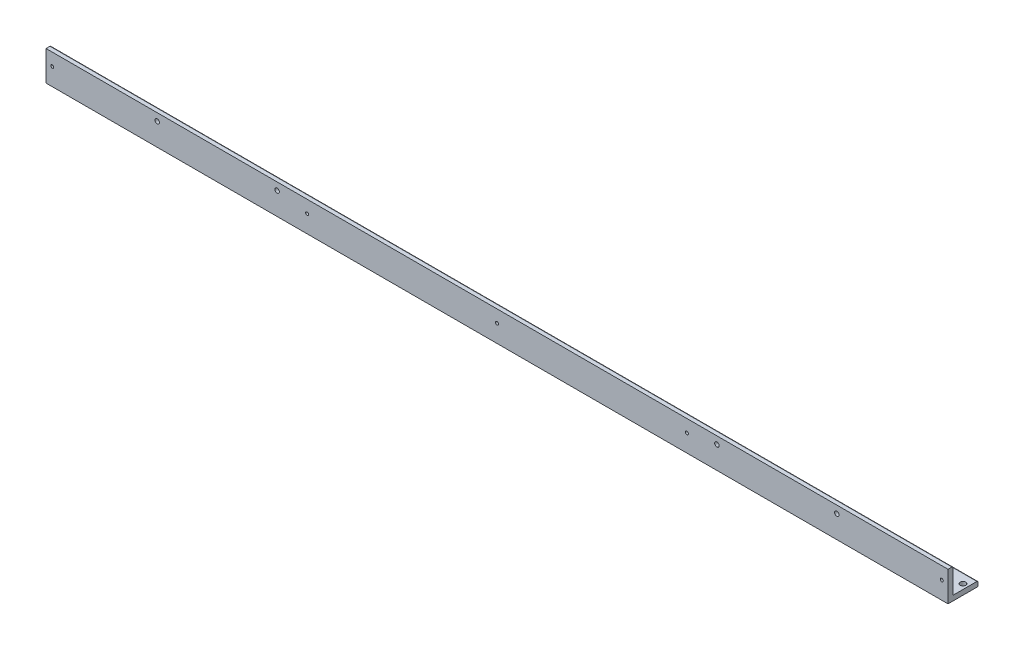
ISO-10303-21;
HEADER;
FILE_DESCRIPTION(('STEP AP214'),'2;1');
FILE_NAME('part.step','',(''),(''),'','','');
FILE_SCHEMA(('AUTOMOTIVE_DESIGN { 1 0 10303 214 1 1 1 1 }'));
ENDSEC;
DATA;
#1=APPLICATION_CONTEXT('core data for automotive mechanical design processes');
#2=APPLICATION_PROTOCOL_DEFINITION('international standard','automotive_design',2000,#1);
#3=PRODUCT_CONTEXT('',#1,'mechanical');
#4=PRODUCT('Part','Part','',(#3));
#5=PRODUCT_RELATED_PRODUCT_CATEGORY('part','',(#4));
#6=PRODUCT_DEFINITION_FORMATION('','',#4);
#7=PRODUCT_DEFINITION_CONTEXT('part definition',#1,'design');
#8=PRODUCT_DEFINITION('design','',#6,#7);
#9=PRODUCT_DEFINITION_SHAPE('','',#8);
#10=(LENGTH_UNIT() NAMED_UNIT(*) SI_UNIT(.MILLI.,.METRE.));
#11=(NAMED_UNIT(*) PLANE_ANGLE_UNIT() SI_UNIT($,.RADIAN.));
#12=(NAMED_UNIT(*) SI_UNIT($,.STERADIAN.) SOLID_ANGLE_UNIT());
#13=UNCERTAINTY_MEASURE_WITH_UNIT(LENGTH_MEASURE(1.E-05),#10,'distance_accuracy_value','');
#14=(GEOMETRIC_REPRESENTATION_CONTEXT(3) GLOBAL_UNCERTAINTY_ASSIGNED_CONTEXT((#13)) GLOBAL_UNIT_ASSIGNED_CONTEXT((#10,
#11,#12)) REPRESENTATION_CONTEXT('',''));
#15=CARTESIAN_POINT('',(0.,0.,0.));
#16=DIRECTION('',(0.,0.,1.));
#17=DIRECTION('',(1.,0.,0.));
#18=AXIS2_PLACEMENT_3D('',#15,#16,#17);
#19=CARTESIAN_POINT('',(573.0875,38.1,0.));
#20=DIRECTION('',(0.,0.,-1.));
#21=DIRECTION('',(0.,1.,0.));
#22=AXIS2_PLACEMENT_3D('',#19,#20,#21);
#23=PLANE('',#22);
#24=CARTESIAN_POINT('',(-431.8,28.575,0.));
#25=DIRECTION('',(0.,0.,1.));
#26=DIRECTION('',(1.,0.,0.));
#27=AXIS2_PLACEMENT_3D('',#24,#25,#26);
#28=CIRCLE('',#27,2.8067);
#29=CARTESIAN_POINT('',(-428.9933,28.575,0.));
#30=VERTEX_POINT('',#29);
#31=EDGE_CURVE('E243',#30,#30,#28,.T.);
#32=ORIENTED_EDGE('',*,*,#31,.F.);
#33=EDGE_LOOP('',(#32));
#34=FACE_BOUND('',#33,.T.);
#35=CARTESIAN_POINT('',(431.8,28.575,0.));
#36=DIRECTION('',(0.,0.,1.));
#37=DIRECTION('',(1.,0.,0.));
#38=AXIS2_PLACEMENT_3D('',#35,#36,#37);
#39=CIRCLE('',#38,2.8067);
#40=CARTESIAN_POINT('',(434.6067,28.575,0.));
#41=VERTEX_POINT('',#40);
#42=EDGE_CURVE('E225',#41,#41,#39,.T.);
#43=ORIENTED_EDGE('',*,*,#42,.F.);
#44=EDGE_LOOP('',(#43));
#45=FACE_BOUND('',#44,.T.);
#46=CARTESIAN_POINT('',(-565.15,22.225,0.));
#47=DIRECTION('',(0.,0.,1.));
#48=DIRECTION('',(1.,0.,0.));
#49=AXIS2_PLACEMENT_3D('',#46,#47,#48);
#50=CIRCLE('',#49,1.89865);
#51=CARTESIAN_POINT('',(-563.25135,22.225,0.));
#52=VERTEX_POINT('',#51);
#53=EDGE_CURVE('E219',#52,#52,#50,.T.);
#54=ORIENTED_EDGE('',*,*,#53,.F.);
#55=EDGE_LOOP('',(#54));
#56=FACE_BOUND('',#55,.T.);
#57=CARTESIAN_POINT('',(565.15,22.225,0.));
#58=DIRECTION('',(0.,0.,1.));
#59=DIRECTION('',(1.,0.,0.));
#60=AXIS2_PLACEMENT_3D('',#57,#58,#59);
#61=CIRCLE('',#60,1.89865);
#62=CARTESIAN_POINT('',(567.04865,22.225,0.));
#63=VERTEX_POINT('',#62);
#64=EDGE_CURVE('E213',#63,#63,#61,.T.);
#65=ORIENTED_EDGE('',*,*,#64,.F.);
#66=EDGE_LOOP('',(#65));
#67=FACE_BOUND('',#66,.T.);
#68=CARTESIAN_POINT('',(-241.3,22.225,0.));
#69=DIRECTION('',(0.,0.,1.));
#70=DIRECTION('',(1.,0.,0.));
#71=AXIS2_PLACEMENT_3D('',#68,#69,#70);
#72=CIRCLE('',#71,1.89865);
#73=CARTESIAN_POINT('',(-239.40135,22.225,0.));
#74=VERTEX_POINT('',#73);
#75=EDGE_CURVE('E207',#74,#74,#72,.T.);
#76=ORIENTED_EDGE('',*,*,#75,.F.);
#77=EDGE_LOOP('',(#76));
#78=FACE_BOUND('',#77,.T.);
#79=CARTESIAN_POINT('',(241.3,22.225,0.));
#80=DIRECTION('',(0.,0.,1.));
#81=DIRECTION('',(1.,0.,0.));
#82=AXIS2_PLACEMENT_3D('',#79,#80,#81);
#83=CIRCLE('',#82,1.89865);
#84=CARTESIAN_POINT('',(243.19865,22.225,0.));
#85=VERTEX_POINT('',#84);
#86=EDGE_CURVE('E201',#85,#85,#83,.T.);
#87=ORIENTED_EDGE('',*,*,#86,.F.);
#88=EDGE_LOOP('',(#87));
#89=FACE_BOUND('',#88,.T.);
#90=CARTESIAN_POINT('',(0.,22.225,0.));
#91=DIRECTION('',(0.,0.,1.));
#92=DIRECTION('',(1.,0.,0.));
#93=AXIS2_PLACEMENT_3D('',#90,#91,#92);
#94=CIRCLE('',#93,1.89864999999999);
#95=CARTESIAN_POINT('',(1.89864999999999,22.225,0.));
#96=VERTEX_POINT('',#95);
#97=EDGE_CURVE('E195',#96,#96,#94,.T.);
#98=ORIENTED_EDGE('',*,*,#97,.F.);
#99=EDGE_LOOP('',(#98));
#100=FACE_BOUND('',#99,.T.);
#101=DIRECTION('',(0.,-1.,0.));
#102=VECTOR('',#101,1.);
#103=CARTESIAN_POINT('',(-573.0875,38.1,0.));
#104=LINE('',#103,#102);
#105=CARTESIAN_POINT('',(-573.0875,38.1,0.));
#106=VERTEX_POINT('',#105);
#107=CARTESIAN_POINT('',(-573.0875,0.,0.));
#108=VERTEX_POINT('',#107);
#109=EDGE_CURVE('E136',#106,#108,#104,.T.);
#110=ORIENTED_EDGE('',*,*,#109,.T.);
#111=DIRECTION('',(-1.,0.,0.));
#112=VECTOR('',#111,1.);
#113=CARTESIAN_POINT('',(573.0875,0.,0.));
#114=LINE('',#113,#112);
#115=CARTESIAN_POINT('',(573.0875,0.,0.));
#116=VERTEX_POINT('',#115);
#117=EDGE_CURVE('E45',#116,#108,#114,.T.);
#118=ORIENTED_EDGE('',*,*,#117,.F.);
#119=DIRECTION('',(0.,-1.,0.));
#120=VECTOR('',#119,1.);
#121=CARTESIAN_POINT('',(573.0875,38.1,0.));
#122=LINE('',#121,#120);
#123=CARTESIAN_POINT('',(573.0875,38.1,0.));
#124=VERTEX_POINT('',#123);
#125=EDGE_CURVE('E96',#124,#116,#122,.T.);
#126=ORIENTED_EDGE('',*,*,#125,.F.);
#127=DIRECTION('',(-1.,0.,0.));
#128=VECTOR('',#127,1.);
#129=CARTESIAN_POINT('',(573.0875,38.1,0.));
#130=LINE('',#129,#128);
#131=EDGE_CURVE('E11',#124,#106,#130,.T.);
#132=ORIENTED_EDGE('',*,*,#131,.T.);
#133=EDGE_LOOP('',(#110,#118,#126,#132));
#134=FACE_BOUND('',#133,.T.);
#135=CARTESIAN_POINT('',(279.4,28.575,0.));
#136=DIRECTION('',(0.,0.,1.));
#137=DIRECTION('',(1.,0.,0.));
#138=AXIS2_PLACEMENT_3D('',#135,#136,#137);
#139=CIRCLE('',#138,2.8067);
#140=CARTESIAN_POINT('',(282.2067,28.575,0.));
#141=VERTEX_POINT('',#140);
#142=EDGE_CURVE('E231',#141,#141,#139,.T.);
#143=ORIENTED_EDGE('',*,*,#142,.F.);
#144=EDGE_LOOP('',(#143));
#145=FACE_BOUND('',#144,.T.);
#146=CARTESIAN_POINT('',(-279.4,28.575,0.));
#147=DIRECTION('',(0.,0.,1.));
#148=DIRECTION('',(1.,0.,0.));
#149=AXIS2_PLACEMENT_3D('',#146,#147,#148);
#150=CIRCLE('',#149,2.8067);
#151=CARTESIAN_POINT('',(-276.5933,28.575,0.));
#152=VERTEX_POINT('',#151);
#153=EDGE_CURVE('E237',#152,#152,#150,.T.);
#154=ORIENTED_EDGE('',*,*,#153,.F.);
#155=EDGE_LOOP('',(#154));
#156=FACE_BOUND('',#155,.T.);
#157=ADVANCED_FACE('F36',(#34,#45,#56,#67,#78,#89,#100,#134,#145,#156),#23,.F.);
#158=CARTESIAN_POINT('',(573.0875,38.1,-4.826));
#159=DIRECTION('',(0.,-1.,0.));
#160=DIRECTION('',(0.,0.,-1.));
#161=AXIS2_PLACEMENT_3D('',#158,#159,#160);
#162=PLANE('',#161);
#163=DIRECTION('',(0.,0.,1.));
#164=VECTOR('',#163,1.);
#165=CARTESIAN_POINT('',(-573.0875,38.1,-4.826));
#166=LINE('',#165,#164);
#167=CARTESIAN_POINT('',(-573.0875,38.1,-4.826));
#168=VERTEX_POINT('',#167);
#169=EDGE_CURVE('E133',#168,#106,#166,.T.);
#170=ORIENTED_EDGE('',*,*,#169,.T.);
#171=ORIENTED_EDGE('',*,*,#131,.F.);
#172=DIRECTION('',(0.,0.,1.));
#173=VECTOR('',#172,1.);
#174=CARTESIAN_POINT('',(573.0875,38.1,-4.826));
#175=LINE('',#174,#173);
#176=CARTESIAN_POINT('',(573.0875,38.1,-4.826));
#177=VERTEX_POINT('',#176);
#178=EDGE_CURVE('E148',#177,#124,#175,.T.);
#179=ORIENTED_EDGE('',*,*,#178,.F.);
#180=DIRECTION('',(-1.,0.,0.));
#181=VECTOR('',#180,1.);
#182=CARTESIAN_POINT('',(573.0875,38.1,-4.826));
#183=LINE('',#182,#181);
#184=EDGE_CURVE('E129',#177,#168,#183,.T.);
#185=ORIENTED_EDGE('',*,*,#184,.T.);
#186=EDGE_LOOP('',(#170,#171,#179,#185));
#187=FACE_BOUND('',#186,.T.);
#188=ADVANCED_FACE('F38',(#187),#162,.F.);
#189=CARTESIAN_POINT('',(573.0875,0.,0.));
#190=DIRECTION('',(0.,1.,0.));
#191=DIRECTION('',(0.,0.,1.));
#192=AXIS2_PLACEMENT_3D('',#189,#190,#191);
#193=PLANE('',#192);
#194=CARTESIAN_POINT('',(566.7375,0.,-25.4));
#195=DIRECTION('',(0.,1.,0.));
#196=DIRECTION('',(0.,0.,1.));
#197=AXIS2_PLACEMENT_3D('',#194,#195,#196);
#198=CIRCLE('',#197,3.57123999999998);
#199=CARTESIAN_POINT('',(566.7375,0.,-21.8287600000001));
#200=VERTEX_POINT('',#199);
#201=EDGE_CURVE('E186',#200,#200,#198,.T.);
#202=ORIENTED_EDGE('',*,*,#201,.T.);
#203=EDGE_LOOP('',(#202));
#204=FACE_BOUND('',#203,.T.);
#205=CARTESIAN_POINT('',(-566.7375,0.,-25.4));
#206=DIRECTION('',(0.,1.,0.));
#207=DIRECTION('',(0.,0.,1.));
#208=AXIS2_PLACEMENT_3D('',#205,#206,#207);
#209=CIRCLE('',#208,3.57123999999998);
#210=CARTESIAN_POINT('',(-566.7375,0.,-21.8287600000001));
#211=VERTEX_POINT('',#210);
#212=EDGE_CURVE('E137',#211,#211,#209,.T.);
#213=ORIENTED_EDGE('',*,*,#212,.T.);
#214=EDGE_LOOP('',(#213));
#215=FACE_BOUND('',#214,.T.);
#216=DIRECTION('',(0.,0.,-1.));
#217=VECTOR('',#216,1.);
#218=CARTESIAN_POINT('',(-573.0875,0.,0.));
#219=LINE('',#218,#217);
#220=CARTESIAN_POINT('',(-573.0875,0.,-38.1));
#221=VERTEX_POINT('',#220);
#222=EDGE_CURVE('E139',#108,#221,#219,.T.);
#223=ORIENTED_EDGE('',*,*,#222,.T.);
#224=DIRECTION('',(-1.,0.,0.));
#225=VECTOR('',#224,1.);
#226=CARTESIAN_POINT('',(573.0875,0.,-38.1));
#227=LINE('',#226,#225);
#228=CARTESIAN_POINT('',(573.0875,0.,-38.1));
#229=VERTEX_POINT('',#228);
#230=EDGE_CURVE('E155',#229,#221,#227,.T.);
#231=ORIENTED_EDGE('',*,*,#230,.F.);
#232=DIRECTION('',(0.,0.,-1.));
#233=VECTOR('',#232,1.);
#234=CARTESIAN_POINT('',(573.0875,0.,0.));
#235=LINE('',#234,#233);
#236=EDGE_CURVE('E163',#116,#229,#235,.T.);
#237=ORIENTED_EDGE('',*,*,#236,.F.);
#238=ORIENTED_EDGE('',*,*,#117,.T.);
#239=EDGE_LOOP('',(#223,#231,#237,#238));
#240=FACE_BOUND('',#239,.T.);
#241=ADVANCED_FACE('F161',(#204,#215,#240),#193,.F.);
#242=CARTESIAN_POINT('',(573.0875,0.,-38.1));
#243=DIRECTION('',(0.,0.,1.));
#244=DIRECTION('',(1.,0.,0.));
#245=AXIS2_PLACEMENT_3D('',#242,#243,#244);
#246=PLANE('',#245);
#247=DIRECTION('',(0.,1.,0.));
#248=VECTOR('',#247,1.);
#249=CARTESIAN_POINT('',(-573.0875,0.,-38.1));
#250=LINE('',#249,#248);
#251=CARTESIAN_POINT('',(-573.0875,4.826,-38.1));
#252=VERTEX_POINT('',#251);
#253=EDGE_CURVE('E141',#221,#252,#250,.T.);
#254=ORIENTED_EDGE('',*,*,#253,.T.);
#255=DIRECTION('',(-1.,0.,0.));
#256=VECTOR('',#255,1.);
#257=CARTESIAN_POINT('',(573.0875,4.826,-38.1));
#258=LINE('',#257,#256);
#259=CARTESIAN_POINT('',(573.0875,4.826,-38.1));
#260=VERTEX_POINT('',#259);
#261=EDGE_CURVE('E152',#260,#252,#258,.T.);
#262=ORIENTED_EDGE('',*,*,#261,.F.);
#263=DIRECTION('',(0.,1.,0.));
#264=VECTOR('',#263,1.);
#265=CARTESIAN_POINT('',(573.0875,0.,-38.1));
#266=LINE('',#265,#264);
#267=EDGE_CURVE('E175',#229,#260,#266,.T.);
#268=ORIENTED_EDGE('',*,*,#267,.F.);
#269=ORIENTED_EDGE('',*,*,#230,.T.);
#270=EDGE_LOOP('',(#254,#262,#268,#269));
#271=FACE_BOUND('',#270,.T.);
#272=ADVANCED_FACE('F171',(#271),#246,.F.);
#273=CARTESIAN_POINT('',(573.0875,4.826,-36.576));
#274=DIRECTION('',(-1.,0.,0.));
#275=DIRECTION('',(0.,0.,1.));
#276=AXIS2_PLACEMENT_3D('',#273,#274,#275);
#277=CYLINDRICAL_SURFACE('',#276,1.524);
#278=CARTESIAN_POINT('',(-573.0875,4.826,-36.576));
#279=DIRECTION('',(1.,0.,0.));
#280=DIRECTION('',(0.,0.,-1.));
#281=AXIS2_PLACEMENT_3D('',#278,#279,#280);
#282=CIRCLE('',#281,1.524);
#283=CARTESIAN_POINT('',(-573.0875,6.34999999999999,-36.576));
#284=VERTEX_POINT('',#283);
#285=EDGE_CURVE('E143',#252,#284,#282,.T.);
#286=ORIENTED_EDGE('',*,*,#285,.T.);
#287=DIRECTION('',(-1.,0.,0.));
#288=VECTOR('',#287,1.);
#289=CARTESIAN_POINT('',(573.0875,6.34999999999999,-36.576));
#290=LINE('',#289,#288);
#291=CARTESIAN_POINT('',(573.0875,6.34999999999999,-36.576));
#292=VERTEX_POINT('',#291);
#293=EDGE_CURVE('E124',#292,#284,#290,.T.);
#294=ORIENTED_EDGE('',*,*,#293,.F.);
#295=CARTESIAN_POINT('',(573.0875,4.826,-36.576));
#296=DIRECTION('',(1.,0.,0.));
#297=DIRECTION('',(0.,0.,-1.));
#298=AXIS2_PLACEMENT_3D('',#295,#296,#297);
#299=CIRCLE('',#298,1.524);
#300=EDGE_CURVE('E115',#260,#292,#299,.T.);
#301=ORIENTED_EDGE('',*,*,#300,.F.);
#302=ORIENTED_EDGE('',*,*,#261,.T.);
#303=EDGE_LOOP('',(#286,#294,#301,#302));
#304=FACE_BOUND('',#303,.T.);
#305=ADVANCED_FACE('F174',(#304),#277,.T.);
#306=CARTESIAN_POINT('',(573.0875,6.34999999999999,-36.576));
#307=DIRECTION('',(0.,-1.,0.));
#308=DIRECTION('',(0.,0.,-1.));
#309=AXIS2_PLACEMENT_3D('',#306,#307,#308);
#310=PLANE('',#309);
#311=CARTESIAN_POINT('',(566.7375,6.34999999999999,-25.4));
#312=DIRECTION('',(0.,1.,0.));
#313=DIRECTION('',(0.,0.,1.));
#314=AXIS2_PLACEMENT_3D('',#311,#312,#313);
#315=CIRCLE('',#314,3.57123999999998);
#316=CARTESIAN_POINT('',(566.7375,6.34999999999999,-21.8287600000001));
#317=VERTEX_POINT('',#316);
#318=EDGE_CURVE('E189',#317,#317,#315,.T.);
#319=ORIENTED_EDGE('',*,*,#318,.F.);
#320=EDGE_LOOP('',(#319));
#321=FACE_BOUND('',#320,.T.);
#322=CARTESIAN_POINT('',(-566.7375,6.34999999999999,-25.4));
#323=DIRECTION('',(0.,1.,0.));
#324=DIRECTION('',(0.,0.,1.));
#325=AXIS2_PLACEMENT_3D('',#322,#323,#324);
#326=CIRCLE('',#325,3.57123999999998);
#327=CARTESIAN_POINT('',(-566.7375,6.34999999999999,-21.8287600000001));
#328=VERTEX_POINT('',#327);
#329=EDGE_CURVE('E183',#328,#328,#326,.T.);
#330=ORIENTED_EDGE('',*,*,#329,.F.);
#331=EDGE_LOOP('',(#330));
#332=FACE_BOUND('',#331,.T.);
#333=DIRECTION('',(0.,0.,1.));
#334=VECTOR('',#333,1.);
#335=CARTESIAN_POINT('',(-573.0875,6.34999999999999,-36.576));
#336=LINE('',#335,#334);
#337=CARTESIAN_POINT('',(-573.0875,6.34999999999999,-6.35000000000002));
#338=VERTEX_POINT('',#337);
#339=EDGE_CURVE('E123',#284,#338,#336,.T.);
#340=ORIENTED_EDGE('',*,*,#339,.T.);
#341=DIRECTION('',(-1.,0.,0.));
#342=VECTOR('',#341,1.);
#343=CARTESIAN_POINT('',(573.0875,6.34999999999999,-6.35000000000002));
#344=LINE('',#343,#342);
#345=CARTESIAN_POINT('',(573.0875,6.34999999999999,-6.35000000000002));
#346=VERTEX_POINT('',#345);
#347=EDGE_CURVE('E120',#346,#338,#344,.T.);
#348=ORIENTED_EDGE('',*,*,#347,.F.);
#349=DIRECTION('',(0.,0.,1.));
#350=VECTOR('',#349,1.);
#351=CARTESIAN_POINT('',(573.0875,6.34999999999999,-36.576));
#352=LINE('',#351,#350);
#353=EDGE_CURVE('E109',#292,#346,#352,.T.);
#354=ORIENTED_EDGE('',*,*,#353,.F.);
#355=ORIENTED_EDGE('',*,*,#293,.T.);
#356=EDGE_LOOP('',(#340,#348,#354,#355));
#357=FACE_BOUND('',#356,.T.);
#358=ADVANCED_FACE('F121',(#321,#332,#357),#310,.F.);
#359=CARTESIAN_POINT('',(573.0875,6.34999999999999,-6.35000000000002));
#360=DIRECTION('',(0.,0.,1.));
#361=DIRECTION('',(0.,-1.,0.));
#362=AXIS2_PLACEMENT_3D('',#359,#360,#361);
#363=PLANE('',#362);
#364=CARTESIAN_POINT('',(-431.8,28.575,-6.35000000000002));
#365=DIRECTION('',(0.,0.,1.));
#366=DIRECTION('',(0.,-1.,0.));
#367=AXIS2_PLACEMENT_3D('',#364,#365,#366);
#368=CIRCLE('',#367,2.8067);
#369=CARTESIAN_POINT('',(-431.8,25.7683,-6.35000000000002));
#370=VERTEX_POINT('',#369);
#371=EDGE_CURVE('E240',#370,#370,#368,.T.);
#372=ORIENTED_EDGE('',*,*,#371,.T.);
#373=EDGE_LOOP('',(#372));
#374=FACE_BOUND('',#373,.T.);
#375=CARTESIAN_POINT('',(-279.4,28.575,-6.35000000000002));
#376=DIRECTION('',(0.,0.,1.));
#377=DIRECTION('',(0.,-1.,0.));
#378=AXIS2_PLACEMENT_3D('',#375,#376,#377);
#379=CIRCLE('',#378,2.8067);
#380=CARTESIAN_POINT('',(-279.4,25.7683,-6.35000000000002));
#381=VERTEX_POINT('',#380);
#382=EDGE_CURVE('E234',#381,#381,#379,.T.);
#383=ORIENTED_EDGE('',*,*,#382,.T.);
#384=EDGE_LOOP('',(#383));
#385=FACE_BOUND('',#384,.T.);
#386=CARTESIAN_POINT('',(279.4,28.575,-6.35000000000002));
#387=DIRECTION('',(0.,0.,1.));
#388=DIRECTION('',(0.,-1.,0.));
#389=AXIS2_PLACEMENT_3D('',#386,#387,#388);
#390=CIRCLE('',#389,2.8067);
#391=CARTESIAN_POINT('',(279.4,25.7683,-6.35000000000002));
#392=VERTEX_POINT('',#391);
#393=EDGE_CURVE('E228',#392,#392,#390,.T.);
#394=ORIENTED_EDGE('',*,*,#393,.T.);
#395=EDGE_LOOP('',(#394));
#396=FACE_BOUND('',#395,.T.);
#397=CARTESIAN_POINT('',(431.8,28.575,-6.35000000000002));
#398=DIRECTION('',(0.,0.,1.));
#399=DIRECTION('',(0.,-1.,0.));
#400=AXIS2_PLACEMENT_3D('',#397,#398,#399);
#401=CIRCLE('',#400,2.8067);
#402=CARTESIAN_POINT('',(431.8,25.7683,-6.35000000000002));
#403=VERTEX_POINT('',#402);
#404=EDGE_CURVE('E222',#403,#403,#401,.T.);
#405=ORIENTED_EDGE('',*,*,#404,.T.);
#406=EDGE_LOOP('',(#405));
#407=FACE_BOUND('',#406,.T.);
#408=CARTESIAN_POINT('',(-565.15,22.225,-6.35000000000002));
#409=DIRECTION('',(0.,0.,1.));
#410=DIRECTION('',(0.,-1.,0.));
#411=AXIS2_PLACEMENT_3D('',#408,#409,#410);
#412=CIRCLE('',#411,1.89865);
#413=CARTESIAN_POINT('',(-565.15,20.32635,-6.35000000000002));
#414=VERTEX_POINT('',#413);
#415=EDGE_CURVE('E216',#414,#414,#412,.T.);
#416=ORIENTED_EDGE('',*,*,#415,.T.);
#417=EDGE_LOOP('',(#416));
#418=FACE_BOUND('',#417,.T.);
#419=CARTESIAN_POINT('',(565.15,22.225,-6.35000000000002));
#420=DIRECTION('',(0.,0.,1.));
#421=DIRECTION('',(0.,-1.,0.));
#422=AXIS2_PLACEMENT_3D('',#419,#420,#421);
#423=CIRCLE('',#422,1.89865);
#424=CARTESIAN_POINT('',(565.15,20.32635,-6.35000000000002));
#425=VERTEX_POINT('',#424);
#426=EDGE_CURVE('E210',#425,#425,#423,.T.);
#427=ORIENTED_EDGE('',*,*,#426,.T.);
#428=EDGE_LOOP('',(#427));
#429=FACE_BOUND('',#428,.T.);
#430=CARTESIAN_POINT('',(-241.3,22.225,-6.35000000000002));
#431=DIRECTION('',(0.,0.,1.));
#432=DIRECTION('',(0.,-1.,0.));
#433=AXIS2_PLACEMENT_3D('',#430,#431,#432);
#434=CIRCLE('',#433,1.89865);
#435=CARTESIAN_POINT('',(-241.3,20.32635,-6.35000000000002));
#436=VERTEX_POINT('',#435);
#437=EDGE_CURVE('E204',#436,#436,#434,.T.);
#438=ORIENTED_EDGE('',*,*,#437,.T.);
#439=EDGE_LOOP('',(#438));
#440=FACE_BOUND('',#439,.T.);
#441=CARTESIAN_POINT('',(241.3,22.225,-6.35000000000002));
#442=DIRECTION('',(0.,0.,1.));
#443=DIRECTION('',(0.,-1.,0.));
#444=AXIS2_PLACEMENT_3D('',#441,#442,#443);
#445=CIRCLE('',#444,1.89865);
#446=CARTESIAN_POINT('',(241.3,20.32635,-6.35000000000002));
#447=VERTEX_POINT('',#446);
#448=EDGE_CURVE('E198',#447,#447,#445,.T.);
#449=ORIENTED_EDGE('',*,*,#448,.T.);
#450=EDGE_LOOP('',(#449));
#451=FACE_BOUND('',#450,.T.);
#452=CARTESIAN_POINT('',(0.,22.225,-6.35000000000002));
#453=DIRECTION('',(0.,0.,1.));
#454=DIRECTION('',(0.,-1.,0.));
#455=AXIS2_PLACEMENT_3D('',#452,#453,#454);
#456=CIRCLE('',#455,1.89864999999999);
#457=CARTESIAN_POINT('',(0.,20.32635,-6.35000000000002));
#458=VERTEX_POINT('',#457);
#459=EDGE_CURVE('E192',#458,#458,#456,.T.);
#460=ORIENTED_EDGE('',*,*,#459,.T.);
#461=EDGE_LOOP('',(#460));
#462=FACE_BOUND('',#461,.T.);
#463=DIRECTION('',(0.,1.,0.));
#464=VECTOR('',#463,1.);
#465=CARTESIAN_POINT('',(-573.0875,6.34999999999999,-6.35000000000002));
#466=LINE('',#465,#464);
#467=CARTESIAN_POINT('',(-573.0875,36.576,-6.35000000000002));
#468=VERTEX_POINT('',#467);
#469=EDGE_CURVE('E82',#338,#468,#466,.T.);
#470=ORIENTED_EDGE('',*,*,#469,.T.);
#471=DIRECTION('',(-1.,0.,0.));
#472=VECTOR('',#471,1.);
#473=CARTESIAN_POINT('',(573.0875,36.576,-6.35000000000002));
#474=LINE('',#473,#472);
#475=CARTESIAN_POINT('',(573.0875,36.576,-6.35000000000002));
#476=VERTEX_POINT('',#475);
#477=EDGE_CURVE('E125',#476,#468,#474,.T.);
#478=ORIENTED_EDGE('',*,*,#477,.F.);
#479=DIRECTION('',(0.,1.,0.));
#480=VECTOR('',#479,1.);
#481=CARTESIAN_POINT('',(573.0875,6.34999999999999,-6.35000000000002));
#482=LINE('',#481,#480);
#483=EDGE_CURVE('E113',#346,#476,#482,.T.);
#484=ORIENTED_EDGE('',*,*,#483,.F.);
#485=ORIENTED_EDGE('',*,*,#347,.T.);
#486=EDGE_LOOP('',(#470,#478,#484,#485));
#487=FACE_BOUND('',#486,.T.);
#488=ADVANCED_FACE('F127',(#374,#385,#396,#407,#418,#429,#440,#451,#462,#487),#363,.F.);
#489=CARTESIAN_POINT('',(573.0875,36.576,-4.826));
#490=DIRECTION('',(-1.,0.,0.));
#491=DIRECTION('',(0.,0.,1.));
#492=AXIS2_PLACEMENT_3D('',#489,#490,#491);
#493=CYLINDRICAL_SURFACE('',#492,1.524);
#494=CARTESIAN_POINT('',(-573.0875,36.576,-4.826));
#495=DIRECTION('',(1.,0.,0.));
#496=DIRECTION('',(0.,0.,-1.));
#497=AXIS2_PLACEMENT_3D('',#494,#495,#496);
#498=CIRCLE('',#497,1.524);
#499=EDGE_CURVE('E88',#468,#168,#498,.T.);
#500=ORIENTED_EDGE('',*,*,#499,.T.);
#501=ORIENTED_EDGE('',*,*,#184,.F.);
#502=CARTESIAN_POINT('',(573.0875,36.576,-4.826));
#503=DIRECTION('',(1.,0.,0.));
#504=DIRECTION('',(0.,0.,-1.));
#505=AXIS2_PLACEMENT_3D('',#502,#503,#504);
#506=CIRCLE('',#505,1.524);
#507=EDGE_CURVE('E53',#476,#177,#506,.T.);
#508=ORIENTED_EDGE('',*,*,#507,.F.);
#509=ORIENTED_EDGE('',*,*,#477,.T.);
#510=EDGE_LOOP('',(#500,#501,#508,#509));
#511=FACE_BOUND('',#510,.T.);
#512=ADVANCED_FACE('F316',(#511),#493,.T.);
#513=CARTESIAN_POINT('',(573.0875,4.826,-36.576));
#514=DIRECTION('',(1.,0.,0.));
#515=DIRECTION('',(0.,0.,-1.));
#516=AXIS2_PLACEMENT_3D('',#513,#514,#515);
#517=PLANE('',#516);
#518=ORIENTED_EDGE('',*,*,#178,.T.);
#519=ORIENTED_EDGE('',*,*,#125,.T.);
#520=ORIENTED_EDGE('',*,*,#236,.T.);
#521=ORIENTED_EDGE('',*,*,#267,.T.);
#522=ORIENTED_EDGE('',*,*,#300,.T.);
#523=ORIENTED_EDGE('',*,*,#353,.T.);
#524=ORIENTED_EDGE('',*,*,#483,.T.);
#525=ORIENTED_EDGE('',*,*,#507,.T.);
#526=EDGE_LOOP('',(#518,#519,#520,#521,#522,#523,#524,#525));
#527=FACE_BOUND('',#526,.T.);
#528=ADVANCED_FACE('F111',(#527),#517,.T.);
#529=CARTESIAN_POINT('',(-573.0875,4.826,-36.576));
#530=DIRECTION('',(1.,0.,0.));
#531=DIRECTION('',(0.,0.,-1.));
#532=AXIS2_PLACEMENT_3D('',#529,#530,#531);
#533=PLANE('',#532);
#534=ORIENTED_EDGE('',*,*,#169,.F.);
#535=ORIENTED_EDGE('',*,*,#499,.F.);
#536=ORIENTED_EDGE('',*,*,#469,.F.);
#537=ORIENTED_EDGE('',*,*,#339,.F.);
#538=ORIENTED_EDGE('',*,*,#285,.F.);
#539=ORIENTED_EDGE('',*,*,#253,.F.);
#540=ORIENTED_EDGE('',*,*,#222,.F.);
#541=ORIENTED_EDGE('',*,*,#109,.F.);
#542=EDGE_LOOP('',(#534,#535,#536,#537,#538,#539,#540,#541));
#543=FACE_BOUND('',#542,.T.);
#544=ADVANCED_FACE('F167',(#543),#533,.F.);
#545=CARTESIAN_POINT('',(-566.7375,6.34999999999999,-25.4));
#546=DIRECTION('',(0.,1.,0.));
#547=DIRECTION('',(0.,0.,1.));
#548=AXIS2_PLACEMENT_3D('',#545,#546,#547);
#549=CYLINDRICAL_SURFACE('',#548,3.57123999999998);
#550=ORIENTED_EDGE('',*,*,#212,.F.);
#551=EDGE_LOOP('',(#550));
#552=FACE_BOUND('',#551,.T.);
#553=ORIENTED_EDGE('',*,*,#329,.T.);
#554=EDGE_LOOP('',(#553));
#555=FACE_BOUND('',#554,.T.);
#556=ADVANCED_FACE('F309',(#552,#555),#549,.F.);
#557=CARTESIAN_POINT('',(566.7375,6.34999999999999,-25.4));
#558=DIRECTION('',(0.,1.,0.));
#559=DIRECTION('',(0.,0.,1.));
#560=AXIS2_PLACEMENT_3D('',#557,#558,#559);
#561=CYLINDRICAL_SURFACE('',#560,3.57123999999998);
#562=ORIENTED_EDGE('',*,*,#201,.F.);
#563=EDGE_LOOP('',(#562));
#564=FACE_BOUND('',#563,.T.);
#565=ORIENTED_EDGE('',*,*,#318,.T.);
#566=EDGE_LOOP('',(#565));
#567=FACE_BOUND('',#566,.T.);
#568=ADVANCED_FACE('F305',(#564,#567),#561,.F.);
#569=CARTESIAN_POINT('',(0.,22.225,0.));
#570=DIRECTION('',(0.,0.,1.));
#571=DIRECTION('',(1.,0.,0.));
#572=AXIS2_PLACEMENT_3D('',#569,#570,#571);
#573=CYLINDRICAL_SURFACE('',#572,1.89864999999999);
#574=ORIENTED_EDGE('',*,*,#459,.F.);
#575=EDGE_LOOP('',(#574));
#576=FACE_BOUND('',#575,.T.);
#577=ORIENTED_EDGE('',*,*,#97,.T.);
#578=EDGE_LOOP('',(#577));
#579=FACE_BOUND('',#578,.T.);
#580=ADVANCED_FACE('F301',(#576,#579),#573,.F.);
#581=CARTESIAN_POINT('',(241.3,22.225,0.));
#582=DIRECTION('',(0.,0.,1.));
#583=DIRECTION('',(1.,0.,0.));
#584=AXIS2_PLACEMENT_3D('',#581,#582,#583);
#585=CYLINDRICAL_SURFACE('',#584,1.89865);
#586=ORIENTED_EDGE('',*,*,#448,.F.);
#587=EDGE_LOOP('',(#586));
#588=FACE_BOUND('',#587,.T.);
#589=ORIENTED_EDGE('',*,*,#86,.T.);
#590=EDGE_LOOP('',(#589));
#591=FACE_BOUND('',#590,.T.);
#592=ADVANCED_FACE('F297',(#588,#591),#585,.F.);
#593=CARTESIAN_POINT('',(-241.3,22.225,0.));
#594=DIRECTION('',(0.,0.,1.));
#595=DIRECTION('',(1.,0.,0.));
#596=AXIS2_PLACEMENT_3D('',#593,#594,#595);
#597=CYLINDRICAL_SURFACE('',#596,1.89865);
#598=ORIENTED_EDGE('',*,*,#437,.F.);
#599=EDGE_LOOP('',(#598));
#600=FACE_BOUND('',#599,.T.);
#601=ORIENTED_EDGE('',*,*,#75,.T.);
#602=EDGE_LOOP('',(#601));
#603=FACE_BOUND('',#602,.T.);
#604=ADVANCED_FACE('F293',(#600,#603),#597,.F.);
#605=CARTESIAN_POINT('',(565.15,22.225,0.));
#606=DIRECTION('',(0.,0.,1.));
#607=DIRECTION('',(1.,0.,0.));
#608=AXIS2_PLACEMENT_3D('',#605,#606,#607);
#609=CYLINDRICAL_SURFACE('',#608,1.89865);
#610=ORIENTED_EDGE('',*,*,#426,.F.);
#611=EDGE_LOOP('',(#610));
#612=FACE_BOUND('',#611,.T.);
#613=ORIENTED_EDGE('',*,*,#64,.T.);
#614=EDGE_LOOP('',(#613));
#615=FACE_BOUND('',#614,.T.);
#616=ADVANCED_FACE('F289',(#612,#615),#609,.F.);
#617=CARTESIAN_POINT('',(-565.15,22.225,0.));
#618=DIRECTION('',(0.,0.,1.));
#619=DIRECTION('',(1.,0.,0.));
#620=AXIS2_PLACEMENT_3D('',#617,#618,#619);
#621=CYLINDRICAL_SURFACE('',#620,1.89865);
#622=ORIENTED_EDGE('',*,*,#415,.F.);
#623=EDGE_LOOP('',(#622));
#624=FACE_BOUND('',#623,.T.);
#625=ORIENTED_EDGE('',*,*,#53,.T.);
#626=EDGE_LOOP('',(#625));
#627=FACE_BOUND('',#626,.T.);
#628=ADVANCED_FACE('F285',(#624,#627),#621,.F.);
#629=CARTESIAN_POINT('',(431.8,28.575,0.));
#630=DIRECTION('',(0.,0.,1.));
#631=DIRECTION('',(1.,0.,0.));
#632=AXIS2_PLACEMENT_3D('',#629,#630,#631);
#633=CYLINDRICAL_SURFACE('',#632,2.8067);
#634=ORIENTED_EDGE('',*,*,#404,.F.);
#635=EDGE_LOOP('',(#634));
#636=FACE_BOUND('',#635,.T.);
#637=ORIENTED_EDGE('',*,*,#42,.T.);
#638=EDGE_LOOP('',(#637));
#639=FACE_BOUND('',#638,.T.);
#640=ADVANCED_FACE('F278',(#636,#639),#633,.F.);
#641=CARTESIAN_POINT('',(279.4,28.575,0.));
#642=DIRECTION('',(0.,0.,1.));
#643=DIRECTION('',(1.,0.,0.));
#644=AXIS2_PLACEMENT_3D('',#641,#642,#643);
#645=CYLINDRICAL_SURFACE('',#644,2.8067);
#646=ORIENTED_EDGE('',*,*,#393,.F.);
#647=EDGE_LOOP('',(#646));
#648=FACE_BOUND('',#647,.T.);
#649=ORIENTED_EDGE('',*,*,#142,.T.);
#650=EDGE_LOOP('',(#649));
#651=FACE_BOUND('',#650,.T.);
#652=ADVANCED_FACE('F269',(#648,#651),#645,.F.);
#653=CARTESIAN_POINT('',(-279.4,28.575,0.));
#654=DIRECTION('',(0.,0.,1.));
#655=DIRECTION('',(1.,0.,0.));
#656=AXIS2_PLACEMENT_3D('',#653,#654,#655);
#657=CYLINDRICAL_SURFACE('',#656,2.8067);
#658=ORIENTED_EDGE('',*,*,#382,.F.);
#659=EDGE_LOOP('',(#658));
#660=FACE_BOUND('',#659,.T.);
#661=ORIENTED_EDGE('',*,*,#153,.T.);
#662=EDGE_LOOP('',(#661));
#663=FACE_BOUND('',#662,.T.);
#664=ADVANCED_FACE('F267',(#660,#663),#657,.F.);
#665=CARTESIAN_POINT('',(-431.8,28.575,0.));
#666=DIRECTION('',(0.,0.,1.));
#667=DIRECTION('',(1.,0.,0.));
#668=AXIS2_PLACEMENT_3D('',#665,#666,#667);
#669=CYLINDRICAL_SURFACE('',#668,2.8067);
#670=ORIENTED_EDGE('',*,*,#371,.F.);
#671=EDGE_LOOP('',(#670));
#672=FACE_BOUND('',#671,.T.);
#673=ORIENTED_EDGE('',*,*,#31,.T.);
#674=EDGE_LOOP('',(#673));
#675=FACE_BOUND('',#674,.T.);
#676=ADVANCED_FACE('F247',(#672,#675),#669,.F.);
#677=CLOSED_SHELL('',(#157,#188,#241,#272,#305,#358,#488,#512,#528,#544,#556,#568,#580,#592,
#604,#616,#628,#640,#652,#664,#676));
#678=MANIFOLD_SOLID_BREP('B2',#677);
#679=ADVANCED_BREP_SHAPE_REPRESENTATION('',(#18,#678),#14);
#680=SHAPE_DEFINITION_REPRESENTATION(#9,#679);
ENDSEC;
END-ISO-10303-21;
